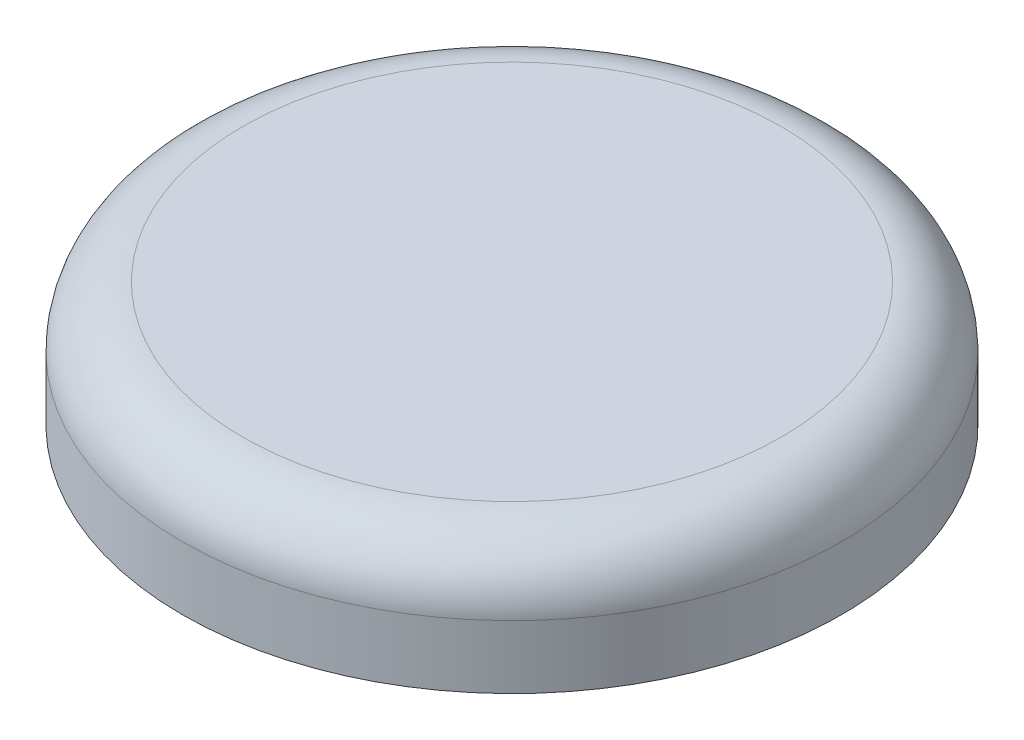
ISO-10303-21;
HEADER;
FILE_DESCRIPTION(('STEP AP214'),'2;1');
FILE_NAME('part.step','',(''),(''),'','','');
FILE_SCHEMA(('AUTOMOTIVE_DESIGN { 1 0 10303 214 1 1 1 1 }'));
ENDSEC;
DATA;
#1=APPLICATION_CONTEXT('core data for automotive mechanical design processes');
#2=APPLICATION_PROTOCOL_DEFINITION('international standard','automotive_design',2000,#1);
#3=PRODUCT_CONTEXT('',#1,'mechanical');
#4=PRODUCT('Part','Part','',(#3));
#5=PRODUCT_RELATED_PRODUCT_CATEGORY('part','',(#4));
#6=PRODUCT_DEFINITION_FORMATION('','',#4);
#7=PRODUCT_DEFINITION_CONTEXT('part definition',#1,'design');
#8=PRODUCT_DEFINITION('design','',#6,#7);
#9=PRODUCT_DEFINITION_SHAPE('','',#8);
#10=(LENGTH_UNIT() NAMED_UNIT(*) SI_UNIT(.MILLI.,.METRE.));
#11=(NAMED_UNIT(*) PLANE_ANGLE_UNIT() SI_UNIT($,.RADIAN.));
#12=(NAMED_UNIT(*) SI_UNIT($,.STERADIAN.) SOLID_ANGLE_UNIT());
#13=UNCERTAINTY_MEASURE_WITH_UNIT(LENGTH_MEASURE(1.E-05),#10,'distance_accuracy_value','');
#14=(GEOMETRIC_REPRESENTATION_CONTEXT(3) GLOBAL_UNCERTAINTY_ASSIGNED_CONTEXT((#13)) GLOBAL_UNIT_ASSIGNED_CONTEXT((#10,
#11,#12)) REPRESENTATION_CONTEXT('',''));
#15=CARTESIAN_POINT('',(0.,0.,0.));
#16=DIRECTION('',(0.,0.,1.));
#17=DIRECTION('',(1.,0.,0.));
#18=AXIS2_PLACEMENT_3D('',#15,#16,#17);
#19=CARTESIAN_POINT('',(0.,5.08,0.));
#20=DIRECTION('',(0.,-1.,0.));
#21=DIRECTION('',(0.,0.,-1.));
#22=AXIS2_PLACEMENT_3D('',#19,#20,#21);
#23=PLANE('',#22);
#24=CARTESIAN_POINT('',(0.,5.07999999999999,0.));
#25=DIRECTION('',(0.,-1.,0.));
#26=DIRECTION('',(0.,0.,-1.));
#27=AXIS2_PLACEMENT_3D('',#24,#25,#26);
#28=CIRCLE('',#27,62.23);
#29=CARTESIAN_POINT('',(0.,5.07999999999999,-62.23));
#30=VERTEX_POINT('',#29);
#31=EDGE_CURVE('E10',#30,#30,#28,.T.);
#32=ORIENTED_EDGE('',*,*,#31,.F.);
#33=EDGE_LOOP('',(#32));
#34=FACE_BOUND('',#33,.T.);
#35=ADVANCED_FACE('F31',(#34),#23,.F.);
#36=CARTESIAN_POINT('',(0.,-8.89000000000001,0.));
#37=DIRECTION('',(0.,-1.,0.));
#38=DIRECTION('',(0.,0.,-1.));
#39=AXIS2_PLACEMENT_3D('',#36,#37,#38);
#40=TOROIDAL_SURFACE('',#39,62.23,13.97);
#41=CARTESIAN_POINT('',(0.,-8.89000000000001,0.));
#42=DIRECTION('',(0.,-1.,0.));
#43=DIRECTION('',(0.,0.,-1.));
#44=AXIS2_PLACEMENT_3D('',#41,#42,#43);
#45=CIRCLE('',#44,76.2);
#46=CARTESIAN_POINT('',(0.,-8.89000000000001,-76.2));
#47=VERTEX_POINT('',#46);
#48=EDGE_CURVE('E37',#47,#47,#45,.T.);
#49=ORIENTED_EDGE('',*,*,#48,.F.);
#50=EDGE_LOOP('',(#49));
#51=FACE_BOUND('',#50,.T.);
#52=ORIENTED_EDGE('',*,*,#31,.T.);
#53=EDGE_LOOP('',(#52));
#54=FACE_BOUND('',#53,.T.);
#55=ADVANCED_FACE('F97',(#51,#54),#40,.T.);
#56=CARTESIAN_POINT('',(0.,0.,0.));
#57=DIRECTION('',(0.,-1.,0.));
#58=DIRECTION('',(0.,0.,-1.));
#59=AXIS2_PLACEMENT_3D('',#56,#57,#58);
#60=CYLINDRICAL_SURFACE('',#59,76.2);
#61=CARTESIAN_POINT('',(0.,-23.495,0.));
#62=DIRECTION('',(0.,-1.,0.));
#63=DIRECTION('',(0.,0.,-1.));
#64=AXIS2_PLACEMENT_3D('',#61,#62,#63);
#65=CIRCLE('',#64,76.2);
#66=CARTESIAN_POINT('',(0.,-23.495,-76.2));
#67=VERTEX_POINT('',#66);
#68=EDGE_CURVE('E41',#67,#67,#65,.T.);
#69=ORIENTED_EDGE('',*,*,#68,.F.);
#70=EDGE_LOOP('',(#69));
#71=FACE_BOUND('',#70,.T.);
#72=ORIENTED_EDGE('',*,*,#48,.T.);
#73=EDGE_LOOP('',(#72));
#74=FACE_BOUND('',#73,.T.);
#75=ADVANCED_FACE('F92',(#71,#74),#60,.T.);
#76=CARTESIAN_POINT('',(-73.66,-23.495,0.));
#77=DIRECTION('',(0.,1.,0.));
#78=DIRECTION('',(0.,0.,1.));
#79=AXIS2_PLACEMENT_3D('',#76,#77,#78);
#80=PLANE('',#79);
#81=CARTESIAN_POINT('',(0.,-23.495,0.));
#82=DIRECTION('',(0.,-1.,0.));
#83=DIRECTION('',(0.,0.,-1.));
#84=AXIS2_PLACEMENT_3D('',#81,#82,#83);
#85=CIRCLE('',#84,73.66);
#86=CARTESIAN_POINT('',(0.,-23.495,-73.66));
#87=VERTEX_POINT('',#86);
#88=EDGE_CURVE('E45',#87,#87,#85,.T.);
#89=ORIENTED_EDGE('',*,*,#88,.F.);
#90=EDGE_LOOP('',(#89));
#91=FACE_BOUND('',#90,.T.);
#92=ORIENTED_EDGE('',*,*,#68,.T.);
#93=EDGE_LOOP('',(#92));
#94=FACE_BOUND('',#93,.T.);
#95=ADVANCED_FACE('F86',(#91,#94),#80,.F.);
#96=CARTESIAN_POINT('',(0.,0.,0.));
#97=DIRECTION('',(0.,-1.,0.));
#98=DIRECTION('',(0.,0.,-1.));
#99=AXIS2_PLACEMENT_3D('',#96,#97,#98);
#100=CYLINDRICAL_SURFACE('',#99,73.66);
#101=CARTESIAN_POINT('',(0.,-10.795,0.));
#102=DIRECTION('',(0.,-1.,0.));
#103=DIRECTION('',(0.,0.,-1.));
#104=AXIS2_PLACEMENT_3D('',#101,#102,#103);
#105=CIRCLE('',#104,73.66);
#106=CARTESIAN_POINT('',(0.,-10.795,-73.66));
#107=VERTEX_POINT('',#106);
#108=EDGE_CURVE('E50',#107,#107,#105,.T.);
#109=ORIENTED_EDGE('',*,*,#108,.F.);
#110=EDGE_LOOP('',(#109));
#111=FACE_BOUND('',#110,.T.);
#112=ORIENTED_EDGE('',*,*,#88,.T.);
#113=EDGE_LOOP('',(#112));
#114=FACE_BOUND('',#113,.T.);
#115=ADVANCED_FACE('F80',(#111,#114),#100,.F.);
#116=CARTESIAN_POINT('',(-71.12,-10.795,0.));
#117=DIRECTION('',(0.,1.,0.));
#118=DIRECTION('',(0.,0.,1.));
#119=AXIS2_PLACEMENT_3D('',#116,#117,#118);
#120=PLANE('',#119);
#121=CARTESIAN_POINT('',(0.,-10.795,0.));
#122=DIRECTION('',(0.,-1.,0.));
#123=DIRECTION('',(0.,0.,-1.));
#124=AXIS2_PLACEMENT_3D('',#121,#122,#123);
#125=CIRCLE('',#124,71.12);
#126=CARTESIAN_POINT('',(0.,-10.795,-71.12));
#127=VERTEX_POINT('',#126);
#128=EDGE_CURVE('E53',#127,#127,#125,.T.);
#129=ORIENTED_EDGE('',*,*,#128,.F.);
#130=EDGE_LOOP('',(#129));
#131=FACE_BOUND('',#130,.T.);
#132=ORIENTED_EDGE('',*,*,#108,.T.);
#133=EDGE_LOOP('',(#132));
#134=FACE_BOUND('',#133,.T.);
#135=ADVANCED_FACE('F74',(#131,#134),#120,.F.);
#136=CARTESIAN_POINT('',(0.,0.,0.));
#137=DIRECTION('',(0.,-1.,0.));
#138=DIRECTION('',(0.,0.,-1.));
#139=AXIS2_PLACEMENT_3D('',#136,#137,#138);
#140=CYLINDRICAL_SURFACE('',#139,71.12);
#141=CARTESIAN_POINT('',(0.,-8.89,0.));
#142=DIRECTION('',(0.,-1.,0.));
#143=DIRECTION('',(0.,0.,-1.));
#144=AXIS2_PLACEMENT_3D('',#141,#142,#143);
#145=CIRCLE('',#144,71.12);
#146=CARTESIAN_POINT('',(0.,-8.89,-71.12));
#147=VERTEX_POINT('',#146);
#148=EDGE_CURVE('E56',#147,#147,#145,.T.);
#149=ORIENTED_EDGE('',*,*,#148,.F.);
#150=EDGE_LOOP('',(#149));
#151=FACE_BOUND('',#150,.T.);
#152=ORIENTED_EDGE('',*,*,#128,.T.);
#153=EDGE_LOOP('',(#152));
#154=FACE_BOUND('',#153,.T.);
#155=ADVANCED_FACE('F68',(#151,#154),#140,.F.);
#156=CARTESIAN_POINT('',(0.,-8.89000000000001,0.));
#157=DIRECTION('',(0.,-1.,0.));
#158=DIRECTION('',(0.,0.,-1.));
#159=AXIS2_PLACEMENT_3D('',#156,#157,#158);
#160=TOROIDAL_SURFACE('',#159,62.23,8.89);
#161=CARTESIAN_POINT('',(0.,0.,0.));
#162=DIRECTION('',(0.,-1.,0.));
#163=DIRECTION('',(0.,0.,-1.));
#164=AXIS2_PLACEMENT_3D('',#161,#162,#163);
#165=CIRCLE('',#164,62.23);
#166=CARTESIAN_POINT('',(0.,0.,-62.23));
#167=VERTEX_POINT('',#166);
#168=EDGE_CURVE('E59',#167,#167,#165,.T.);
#169=ORIENTED_EDGE('',*,*,#168,.F.);
#170=EDGE_LOOP('',(#169));
#171=FACE_BOUND('',#170,.T.);
#172=ORIENTED_EDGE('',*,*,#148,.T.);
#173=EDGE_LOOP('',(#172));
#174=FACE_BOUND('',#173,.T.);
#175=ADVANCED_FACE('F65',(#171,#174),#160,.F.);
#176=CARTESIAN_POINT('',(0.,0.,0.));
#177=DIRECTION('',(0.,1.,0.));
#178=DIRECTION('',(0.,0.,1.));
#179=AXIS2_PLACEMENT_3D('',#176,#177,#178);
#180=PLANE('',#179);
#181=ORIENTED_EDGE('',*,*,#168,.T.);
#182=EDGE_LOOP('',(#181));
#183=FACE_BOUND('',#182,.T.);
#184=ADVANCED_FACE('F63',(#183),#180,.F.);
#185=CLOSED_SHELL('',(#35,#55,#75,#95,#115,#135,#155,#175,#184));
#186=MANIFOLD_SOLID_BREP('B2',#185);
#187=ADVANCED_BREP_SHAPE_REPRESENTATION('',(#18,#186),#14);
#188=SHAPE_DEFINITION_REPRESENTATION(#9,#187);
ENDSEC;
END-ISO-10303-21;
